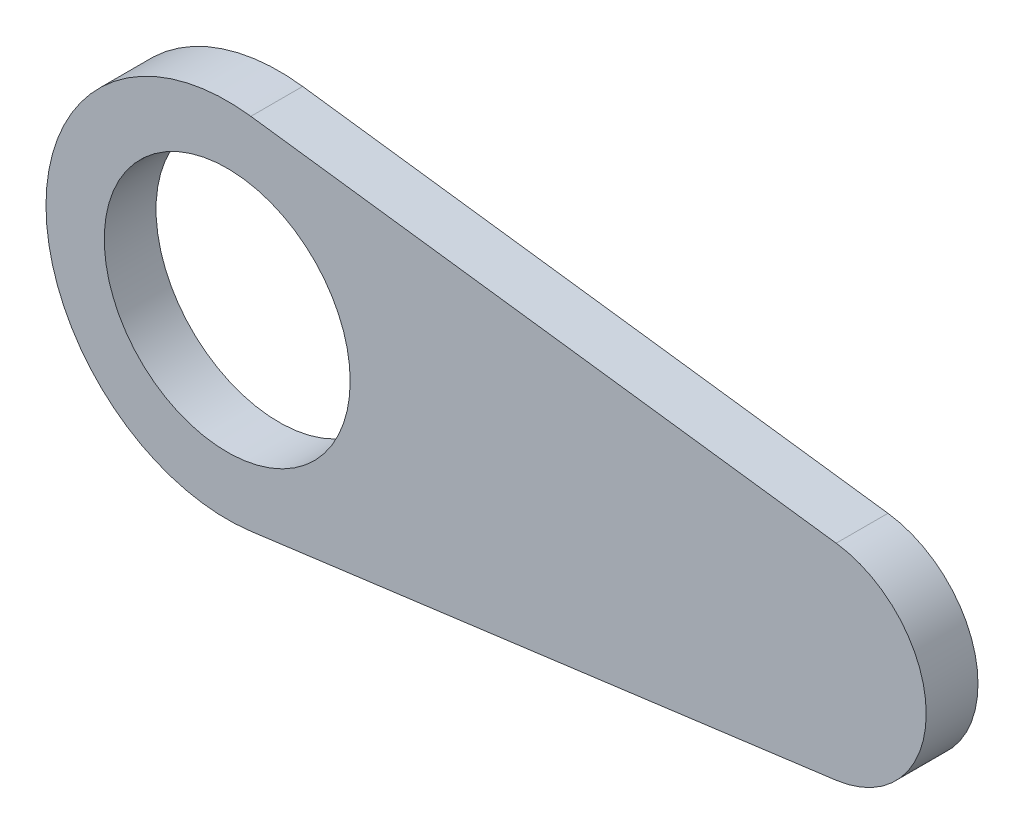
ISO-10303-21;
HEADER;
FILE_DESCRIPTION(('STEP AP214'),'2;1');
FILE_NAME('part.step','',(''),(''),'','','');
FILE_SCHEMA(('AUTOMOTIVE_DESIGN { 1 0 10303 214 1 1 1 1 }'));
ENDSEC;
DATA;
#1=APPLICATION_CONTEXT('core data for automotive mechanical design processes');
#2=APPLICATION_PROTOCOL_DEFINITION('international standard','automotive_design',2000,#1);
#3=PRODUCT_CONTEXT('',#1,'mechanical');
#4=PRODUCT('Part','Part','',(#3));
#5=PRODUCT_RELATED_PRODUCT_CATEGORY('part','',(#4));
#6=PRODUCT_DEFINITION_FORMATION('','',#4);
#7=PRODUCT_DEFINITION_CONTEXT('part definition',#1,'design');
#8=PRODUCT_DEFINITION('design','',#6,#7);
#9=PRODUCT_DEFINITION_SHAPE('','',#8);
#10=(LENGTH_UNIT() NAMED_UNIT(*) SI_UNIT(.MILLI.,.METRE.));
#11=(NAMED_UNIT(*) PLANE_ANGLE_UNIT() SI_UNIT($,.RADIAN.));
#12=(NAMED_UNIT(*) SI_UNIT($,.STERADIAN.) SOLID_ANGLE_UNIT());
#13=UNCERTAINTY_MEASURE_WITH_UNIT(LENGTH_MEASURE(1.E-05),#10,'distance_accuracy_value','');
#14=(GEOMETRIC_REPRESENTATION_CONTEXT(3) GLOBAL_UNCERTAINTY_ASSIGNED_CONTEXT((#13)) GLOBAL_UNIT_ASSIGNED_CONTEXT((#10,
#11,#12)) REPRESENTATION_CONTEXT('',''));
#15=CARTESIAN_POINT('',(0.,0.,0.));
#16=DIRECTION('',(0.,0.,1.));
#17=DIRECTION('',(1.,0.,0.));
#18=AXIS2_PLACEMENT_3D('',#15,#16,#17);
#19=CARTESIAN_POINT('',(0.91304347826087,6.94019823973388,2.));
#20=DIRECTION('',(0.130434782608696,0.991456891390555,0.));
#21=DIRECTION('',(-0.991456891390555,0.130434782608696,0.));
#22=AXIS2_PLACEMENT_3D('',#19,#20,#21);
#23=PLANE('',#22);
#24=DIRECTION('',(0.991456891390555,-0.130434782608696,0.));
#25=VECTOR('',#24,1.);
#26=CARTESIAN_POINT('',(0.91304347826087,6.94019823973388,0.));
#27=LINE('',#26,#25);
#28=CARTESIAN_POINT('',(0.91304347826087,6.94019823973388,0.));
#29=VERTEX_POINT('',#28);
#30=CARTESIAN_POINT('',(23.5217391304348,3.96582756556222,0.));
#31=VERTEX_POINT('',#30);
#32=EDGE_CURVE('E100',#29,#31,#27,.T.);
#33=ORIENTED_EDGE('',*,*,#32,.F.);
#34=DIRECTION('',(0.,0.,-1.));
#35=VECTOR('',#34,1.);
#36=CARTESIAN_POINT('',(0.91304347826087,6.94019823973388,2.));
#37=LINE('',#36,#35);
#38=CARTESIAN_POINT('',(0.91304347826087,6.94019823973388,2.));
#39=VERTEX_POINT('',#38);
#40=EDGE_CURVE('E11',#39,#29,#37,.T.);
#41=ORIENTED_EDGE('',*,*,#40,.F.);
#42=DIRECTION('',(0.991456891390555,-0.130434782608696,0.));
#43=VECTOR('',#42,1.);
#44=CARTESIAN_POINT('',(0.91304347826087,6.94019823973388,2.));
#45=LINE('',#44,#43);
#46=CARTESIAN_POINT('',(23.5217391304348,3.96582756556222,2.));
#47=VERTEX_POINT('',#46);
#48=EDGE_CURVE('E85',#39,#47,#45,.T.);
#49=ORIENTED_EDGE('',*,*,#48,.T.);
#50=DIRECTION('',(0.,0.,-1.));
#51=VECTOR('',#50,1.);
#52=CARTESIAN_POINT('',(23.5217391304348,3.96582756556222,2.));
#53=LINE('',#52,#51);
#54=EDGE_CURVE('E73',#47,#31,#53,.T.);
#55=ORIENTED_EDGE('',*,*,#54,.T.);
#56=EDGE_LOOP('',(#33,#41,#49,#55));
#57=FACE_BOUND('',#56,.T.);
#58=ADVANCED_FACE('F34',(#57),#23,.T.);
#59=CARTESIAN_POINT('',(0.,0.,2.));
#60=DIRECTION('',(0.,0.,-1.));
#61=DIRECTION('',(-1.,0.,0.));
#62=AXIS2_PLACEMENT_3D('',#59,#60,#61);
#63=CYLINDRICAL_SURFACE('',#62,7.);
#64=CARTESIAN_POINT('',(0.,0.,0.));
#65=DIRECTION('',(0.,0.,1.));
#66=DIRECTION('',(1.,0.,0.));
#67=AXIS2_PLACEMENT_3D('',#64,#65,#66);
#68=CIRCLE('',#67,7.);
#69=CARTESIAN_POINT('',(0.91304347826087,-6.94019823973388,0.));
#70=VERTEX_POINT('',#69);
#71=EDGE_CURVE('E90',#29,#70,#68,.T.);
#72=ORIENTED_EDGE('',*,*,#71,.T.);
#73=DIRECTION('',(0.,0.,-1.));
#74=VECTOR('',#73,1.);
#75=CARTESIAN_POINT('',(0.91304347826087,-6.94019823973388,2.));
#76=LINE('',#75,#74);
#77=CARTESIAN_POINT('',(0.91304347826087,-6.94019823973388,2.));
#78=VERTEX_POINT('',#77);
#79=EDGE_CURVE('E42',#78,#70,#76,.T.);
#80=ORIENTED_EDGE('',*,*,#79,.F.);
#81=CARTESIAN_POINT('',(0.,0.,2.));
#82=DIRECTION('',(0.,0.,1.));
#83=DIRECTION('',(1.,0.,0.));
#84=AXIS2_PLACEMENT_3D('',#81,#82,#83);
#85=CIRCLE('',#84,7.);
#86=EDGE_CURVE('E79',#39,#78,#85,.T.);
#87=ORIENTED_EDGE('',*,*,#86,.F.);
#88=ORIENTED_EDGE('',*,*,#40,.T.);
#89=EDGE_LOOP('',(#72,#80,#87,#88));
#90=FACE_BOUND('',#89,.T.);
#91=ADVANCED_FACE('F88',(#90),#63,.T.);
#92=CARTESIAN_POINT('',(0.91304347826087,-6.94019823973388,2.));
#93=DIRECTION('',(-0.130434782608696,0.991456891390555,0.));
#94=DIRECTION('',(-0.991456891390555,-0.130434782608696,0.));
#95=AXIS2_PLACEMENT_3D('',#92,#93,#94);
#96=PLANE('',#95);
#97=DIRECTION('',(0.991456891390555,0.130434782608696,0.));
#98=VECTOR('',#97,1.);
#99=CARTESIAN_POINT('',(0.91304347826087,-6.94019823973388,0.));
#100=LINE('',#99,#98);
#101=CARTESIAN_POINT('',(23.5217391304348,-3.96582756556222,0.));
#102=VERTEX_POINT('',#101);
#103=EDGE_CURVE('E66',#70,#102,#100,.T.);
#104=ORIENTED_EDGE('',*,*,#103,.T.);
#105=DIRECTION('',(0.,0.,-1.));
#106=VECTOR('',#105,1.);
#107=CARTESIAN_POINT('',(23.5217391304348,-3.96582756556222,2.));
#108=LINE('',#107,#106);
#109=CARTESIAN_POINT('',(23.5217391304348,-3.96582756556222,2.));
#110=VERTEX_POINT('',#109);
#111=EDGE_CURVE('E91',#110,#102,#108,.T.);
#112=ORIENTED_EDGE('',*,*,#111,.F.);
#113=DIRECTION('',(0.991456891390555,0.130434782608696,0.));
#114=VECTOR('',#113,1.);
#115=CARTESIAN_POINT('',(0.91304347826087,-6.94019823973388,2.));
#116=LINE('',#115,#114);
#117=EDGE_CURVE('E84',#78,#110,#116,.T.);
#118=ORIENTED_EDGE('',*,*,#117,.F.);
#119=ORIENTED_EDGE('',*,*,#79,.T.);
#120=EDGE_LOOP('',(#104,#112,#118,#119));
#121=FACE_BOUND('',#120,.T.);
#122=ADVANCED_FACE('F92',(#121),#96,.F.);
#123=CARTESIAN_POINT('',(23.,0.,2.));
#124=DIRECTION('',(0.,0.,-1.));
#125=DIRECTION('',(-1.,0.,0.));
#126=AXIS2_PLACEMENT_3D('',#123,#124,#125);
#127=CYLINDRICAL_SURFACE('',#126,4.);
#128=CARTESIAN_POINT('',(23.,0.,0.));
#129=DIRECTION('',(0.,0.,1.));
#130=DIRECTION('',(1.,0.,0.));
#131=AXIS2_PLACEMENT_3D('',#128,#129,#130);
#132=CIRCLE('',#131,4.);
#133=EDGE_CURVE('E105',#102,#31,#132,.T.);
#134=ORIENTED_EDGE('',*,*,#133,.T.);
#135=ORIENTED_EDGE('',*,*,#54,.F.);
#136=CARTESIAN_POINT('',(23.,0.,2.));
#137=DIRECTION('',(0.,0.,1.));
#138=DIRECTION('',(1.,0.,0.));
#139=AXIS2_PLACEMENT_3D('',#136,#137,#138);
#140=CIRCLE('',#139,4.);
#141=EDGE_CURVE('E50',#110,#47,#140,.T.);
#142=ORIENTED_EDGE('',*,*,#141,.F.);
#143=ORIENTED_EDGE('',*,*,#111,.T.);
#144=EDGE_LOOP('',(#134,#135,#142,#143));
#145=FACE_BOUND('',#144,.T.);
#146=ADVANCED_FACE('F113',(#145),#127,.T.);
#147=CARTESIAN_POINT('',(0.,0.,2.));
#148=DIRECTION('',(0.,0.,-1.));
#149=DIRECTION('',(-1.,0.,0.));
#150=AXIS2_PLACEMENT_3D('',#147,#148,#149);
#151=CYLINDRICAL_SURFACE('',#150,4.75);
#152=CARTESIAN_POINT('',(0.,0.,2.));
#153=DIRECTION('',(0.,0.,1.));
#154=DIRECTION('',(1.,0.,0.));
#155=AXIS2_PLACEMENT_3D('',#152,#153,#154);
#156=CIRCLE('',#155,4.75);
#157=CARTESIAN_POINT('',(4.75,0.,2.));
#158=VERTEX_POINT('',#157);
#159=EDGE_CURVE('E94',#158,#158,#156,.T.);
#160=ORIENTED_EDGE('',*,*,#159,.T.);
#161=EDGE_LOOP('',(#160));
#162=FACE_BOUND('',#161,.T.);
#163=CARTESIAN_POINT('',(0.,0.,0.));
#164=DIRECTION('',(0.,0.,1.));
#165=DIRECTION('',(1.,0.,0.));
#166=AXIS2_PLACEMENT_3D('',#163,#164,#165);
#167=CIRCLE('',#166,4.75);
#168=CARTESIAN_POINT('',(4.75,0.,0.));
#169=VERTEX_POINT('',#168);
#170=EDGE_CURVE('E107',#169,#169,#167,.T.);
#171=ORIENTED_EDGE('',*,*,#170,.F.);
#172=EDGE_LOOP('',(#171));
#173=FACE_BOUND('',#172,.T.);
#174=ADVANCED_FACE('F128',(#162,#173),#151,.F.);
#175=CARTESIAN_POINT('',(0.,0.,2.));
#176=DIRECTION('',(0.,0.,1.));
#177=DIRECTION('',(1.,0.,0.));
#178=AXIS2_PLACEMENT_3D('',#175,#176,#177);
#179=PLANE('',#178);
#180=ORIENTED_EDGE('',*,*,#48,.F.);
#181=ORIENTED_EDGE('',*,*,#86,.T.);
#182=ORIENTED_EDGE('',*,*,#117,.T.);
#183=ORIENTED_EDGE('',*,*,#141,.T.);
#184=EDGE_LOOP('',(#180,#181,#182,#183));
#185=FACE_BOUND('',#184,.T.);
#186=ORIENTED_EDGE('',*,*,#159,.F.);
#187=EDGE_LOOP('',(#186));
#188=FACE_BOUND('',#187,.T.);
#189=ADVANCED_FACE('F81',(#185,#188),#179,.T.);
#190=CARTESIAN_POINT('',(0.,0.,0.));
#191=DIRECTION('',(0.,0.,1.));
#192=DIRECTION('',(1.,0.,0.));
#193=AXIS2_PLACEMENT_3D('',#190,#191,#192);
#194=PLANE('',#193);
#195=ORIENTED_EDGE('',*,*,#32,.T.);
#196=ORIENTED_EDGE('',*,*,#133,.F.);
#197=ORIENTED_EDGE('',*,*,#103,.F.);
#198=ORIENTED_EDGE('',*,*,#71,.F.);
#199=EDGE_LOOP('',(#195,#196,#197,#198));
#200=FACE_BOUND('',#199,.T.);
#201=ORIENTED_EDGE('',*,*,#170,.T.);
#202=EDGE_LOOP('',(#201));
#203=FACE_BOUND('',#202,.T.);
#204=ADVANCED_FACE('F115',(#200,#203),#194,.F.);
#205=CLOSED_SHELL('',(#58,#91,#122,#146,#174,#189,#204));
#206=MANIFOLD_SOLID_BREP('B2',#205);
#207=ADVANCED_BREP_SHAPE_REPRESENTATION('',(#18,#206),#14);
#208=SHAPE_DEFINITION_REPRESENTATION(#9,#207);
ENDSEC;
END-ISO-10303-21;
